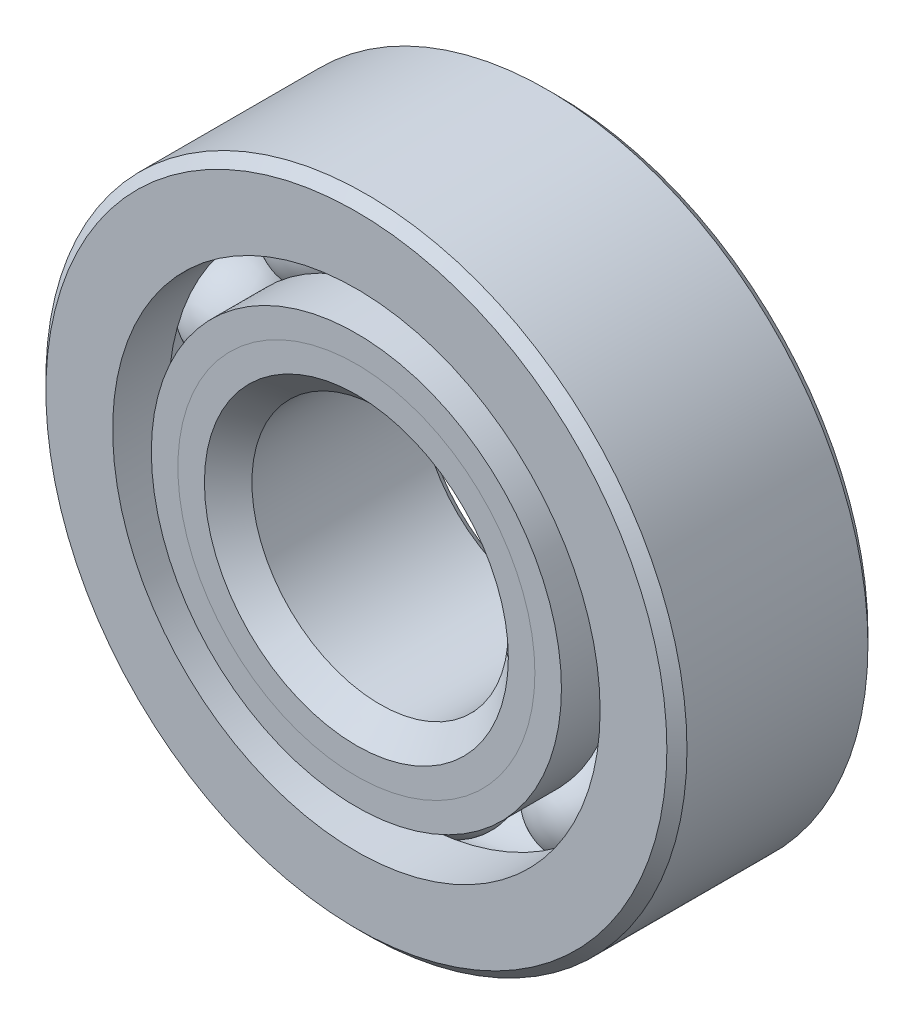
ISO-10303-21;
HEADER;
FILE_DESCRIPTION(('STEP AP214'),'2;1');
FILE_NAME('part.step','',(''),(''),'','','');
FILE_SCHEMA(('AUTOMOTIVE_DESIGN { 1 0 10303 214 1 1 1 1 }'));
ENDSEC;
DATA;
#1=APPLICATION_CONTEXT('core data for automotive mechanical design processes');
#2=APPLICATION_PROTOCOL_DEFINITION('international standard','automotive_design',2000,#1);
#3=PRODUCT_CONTEXT('',#1,'mechanical');
#4=PRODUCT('Part','Part','',(#3));
#5=PRODUCT_RELATED_PRODUCT_CATEGORY('part','',(#4));
#6=PRODUCT_DEFINITION_FORMATION('','',#4);
#7=PRODUCT_DEFINITION_CONTEXT('part definition',#1,'design');
#8=PRODUCT_DEFINITION('design','',#6,#7);
#9=PRODUCT_DEFINITION_SHAPE('','',#8);
#10=(LENGTH_UNIT() NAMED_UNIT(*) SI_UNIT(.MILLI.,.METRE.));
#11=(NAMED_UNIT(*) PLANE_ANGLE_UNIT() SI_UNIT($,.RADIAN.));
#12=(NAMED_UNIT(*) SI_UNIT($,.STERADIAN.) SOLID_ANGLE_UNIT());
#13=UNCERTAINTY_MEASURE_WITH_UNIT(LENGTH_MEASURE(1.E-05),#10,'distance_accuracy_value','');
#14=(GEOMETRIC_REPRESENTATION_CONTEXT(3) GLOBAL_UNCERTAINTY_ASSIGNED_CONTEXT((#13)) GLOBAL_UNIT_ASSIGNED_CONTEXT((#10,
#11,#12)) REPRESENTATION_CONTEXT('',''));
#15=CARTESIAN_POINT('',(0.,0.,0.));
#16=DIRECTION('',(0.,0.,1.));
#17=DIRECTION('',(1.,0.,0.));
#18=AXIS2_PLACEMENT_3D('',#15,#16,#17);
#19=CARTESIAN_POINT('',(-3.26588180805,4.49510067499584,0.));
#20=DIRECTION('',(0.,0.,1.));
#21=DIRECTION('',(-0.587785252292462,0.809016994374955,0.));
#22=AXIS2_PLACEMENT_3D('',#19,#20,#21);
#23=SPHERICAL_SURFACE('',#22,1.20554465033679);
#24=CARTESIAN_POINT('',(-3.26588180805,4.49510067499584,1.20554465033679));
#25=VERTEX_POINT('',#24);
#26=VERTEX_LOOP('',#25);
#27=FACE_BOUND('',#26,.T.);
#28=ADVANCED_FACE('F37',(#27),#23,.T.);
#29=CLOSED_SHELL('',(#28));
#30=MANIFOLD_SOLID_BREP('B2',#29);
#31=CARTESIAN_POINT('',(-5.28430776866493,1.71697567499586,0.));
#32=DIRECTION('',(0.,0.,1.));
#33=DIRECTION('',(-0.95105651629515,0.309016994374958,0.));
#34=AXIS2_PLACEMENT_3D('',#31,#32,#33);
#35=SPHERICAL_SURFACE('',#34,1.20554465033679);
#36=CARTESIAN_POINT('',(-5.28430776866493,1.71697567499586,1.20554465033679));
#37=VERTEX_POINT('',#36);
#38=VERTEX_LOOP('',#37);
#39=FACE_BOUND('',#38,.T.);
#40=ADVANCED_FACE('F68',(#39),#35,.T.);
#41=CLOSED_SHELL('',(#40));
#42=MANIFOLD_SOLID_BREP('B6',#41);
#43=CARTESIAN_POINT('',(-5.28430776866496,-1.71697567499575,0.));
#44=DIRECTION('',(0.,0.,1.));
#45=DIRECTION('',(-0.951056516295157,-0.309016994374938,0.));
#46=AXIS2_PLACEMENT_3D('',#43,#44,#45);
#47=SPHERICAL_SURFACE('',#46,1.20554465033679);
#48=CARTESIAN_POINT('',(-5.28430776866496,-1.71697567499575,1.20554465033679));
#49=VERTEX_POINT('',#48);
#50=VERTEX_LOOP('',#49);
#51=FACE_BOUND('',#50,.T.);
#52=ADVANCED_FACE('F97',(#51),#47,.T.);
#53=CLOSED_SHELL('',(#52));
#54=MANIFOLD_SOLID_BREP('B33',#53);
#55=CARTESIAN_POINT('',(-3.26588180805009,-4.49510067499577,0.));
#56=DIRECTION('',(0.,0.,1.));
#57=DIRECTION('',(-0.58778525229248,-0.809016994374942,0.));
#58=AXIS2_PLACEMENT_3D('',#55,#56,#57);
#59=SPHERICAL_SURFACE('',#58,1.20554465033679);
#60=CARTESIAN_POINT('',(-3.26588180805009,-4.49510067499577,1.20554465033679));
#61=VERTEX_POINT('',#60);
#62=VERTEX_LOOP('',#61);
#63=FACE_BOUND('',#62,.T.);
#64=ADVANCED_FACE('F128',(#63),#59,.T.);
#65=CLOSED_SHELL('',(#64));
#66=MANIFOLD_SOLID_BREP('B64',#65);
#67=CARTESIAN_POINT('',(0.,-5.55625,0.));
#68=DIRECTION('',(0.,0.,1.));
#69=DIRECTION('',(0.,-1.,0.));
#70=AXIS2_PLACEMENT_3D('',#67,#68,#69);
#71=SPHERICAL_SURFACE('',#70,1.20554465033679);
#72=CARTESIAN_POINT('',(0.,-5.55625,1.20554465033679));
#73=VERTEX_POINT('',#72);
#74=VERTEX_LOOP('',#73);
#75=FACE_BOUND('',#74,.T.);
#76=ADVANCED_FACE('F159',(#75),#71,.T.);
#77=CLOSED_SHELL('',(#76));
#78=MANIFOLD_SOLID_BREP('B93',#77);
#79=CARTESIAN_POINT('',(3.26588180805003,-4.49510067499582,0.));
#80=DIRECTION('',(0.,0.,1.));
#81=DIRECTION('',(0.587785252292469,-0.809016994374951,0.));
#82=AXIS2_PLACEMENT_3D('',#79,#80,#81);
#83=SPHERICAL_SURFACE('',#82,1.20554465033679);
#84=CARTESIAN_POINT('',(3.26588180805003,-4.49510067499582,1.20554465033679));
#85=VERTEX_POINT('',#84);
#86=VERTEX_LOOP('',#85);
#87=FACE_BOUND('',#86,.T.);
#88=ADVANCED_FACE('F190',(#87),#83,.T.);
#89=CLOSED_SHELL('',(#88));
#90=MANIFOLD_SOLID_BREP('B124',#89);
#91=CARTESIAN_POINT('',(5.28430776866494,-1.71697567499582,0.));
#92=DIRECTION('',(0.,0.,1.));
#93=DIRECTION('',(0.951056516295152,-0.309016994374952,0.));
#94=AXIS2_PLACEMENT_3D('',#91,#92,#93);
#95=SPHERICAL_SURFACE('',#94,1.20554465033679);
#96=CARTESIAN_POINT('',(5.28430776866494,-1.71697567499582,1.20554465033679));
#97=VERTEX_POINT('',#96);
#98=VERTEX_LOOP('',#97);
#99=FACE_BOUND('',#98,.T.);
#100=ADVANCED_FACE('F221',(#99),#95,.T.);
#101=CLOSED_SHELL('',(#100));
#102=MANIFOLD_SOLID_BREP('B155',#101);
#103=CARTESIAN_POINT('',(5.28430776866495,1.71697567499579,0.));
#104=DIRECTION('',(0.,0.,1.));
#105=DIRECTION('',(0.951056516295155,0.309016994374945,0.));
#106=AXIS2_PLACEMENT_3D('',#103,#104,#105);
#107=SPHERICAL_SURFACE('',#106,1.20554465033679);
#108=CARTESIAN_POINT('',(5.28430776866495,1.71697567499579,1.20554465033679));
#109=VERTEX_POINT('',#108);
#110=VERTEX_LOOP('',#109);
#111=FACE_BOUND('',#110,.T.);
#112=ADVANCED_FACE('F252',(#111),#107,.T.);
#113=CLOSED_SHELL('',(#112));
#114=MANIFOLD_SOLID_BREP('B186',#113);
#115=CARTESIAN_POINT('',(3.26588180805006,4.4951006749958,0.));
#116=DIRECTION('',(0.,0.,1.));
#117=DIRECTION('',(0.587785252292474,0.809016994374947,0.));
#118=AXIS2_PLACEMENT_3D('',#115,#116,#117);
#119=SPHERICAL_SURFACE('',#118,1.20554465033679);
#120=CARTESIAN_POINT('',(3.26588180805006,4.4951006749958,1.20554465033679));
#121=VERTEX_POINT('',#120);
#122=VERTEX_LOOP('',#121);
#123=FACE_BOUND('',#122,.T.);
#124=ADVANCED_FACE('F281',(#123),#119,.T.);
#125=CLOSED_SHELL('',(#124));
#126=MANIFOLD_SOLID_BREP('B217',#125);
#127=CARTESIAN_POINT('',(0.,5.55625,0.));
#128=DIRECTION('',(0.,0.,1.));
#129=DIRECTION('',(0.,1.,0.));
#130=AXIS2_PLACEMENT_3D('',#127,#128,#129);
#131=SPHERICAL_SURFACE('',#130,1.20554465033679);
#132=CARTESIAN_POINT('',(0.,5.55625,1.20554465033679));
#133=VERTEX_POINT('',#132);
#134=VERTEX_LOOP('',#133);
#135=FACE_BOUND('',#134,.T.);
#136=ADVANCED_FACE('F314',(#135),#131,.T.);
#137=CLOSED_SHELL('',(#136));
#138=MANIFOLD_SOLID_BREP('B248',#137);
#139=CARTESIAN_POINT('',(0.,4.42006562313009,2.4892));
#140=DIRECTION('',(0.,0.,-1.));
#141=DIRECTION('',(-1.,0.,0.));
#142=AXIS2_PLACEMENT_3D('',#139,#140,#141);
#143=PLANE('',#142);
#144=CARTESIAN_POINT('',(0.,0.,2.4892));
#145=DIRECTION('',(0.,0.,1.));
#146=DIRECTION('',(1.,0.,0.));
#147=AXIS2_PLACEMENT_3D('',#144,#145,#146);
#148=CIRCLE('',#147,3.76285267483161);
#149=CARTESIAN_POINT('',(3.76285267483161,0.,2.4892));
#150=VERTEX_POINT('',#149);
#151=EDGE_CURVE('E368',#150,#150,#148,.T.);
#152=ORIENTED_EDGE('',*,*,#151,.F.);
#153=EDGE_LOOP('',(#152));
#154=FACE_BOUND('',#153,.T.);
#155=CARTESIAN_POINT('',(0.,0.,2.4892));
#156=DIRECTION('',(0.,0.,1.));
#157=DIRECTION('',(1.,0.,0.));
#158=AXIS2_PLACEMENT_3D('',#155,#156,#157);
#159=CIRCLE('',#158,4.42006562313009);
#160=CARTESIAN_POINT('',(4.42006562313009,0.,2.4892));
#161=VERTEX_POINT('',#160);
#162=EDGE_CURVE('E313',#161,#161,#159,.T.);
#163=ORIENTED_EDGE('',*,*,#162,.T.);
#164=EDGE_LOOP('',(#163));
#165=FACE_BOUND('',#164,.T.);
#166=ADVANCED_FACE('F334',(#154,#165),#143,.F.);
#167=CARTESIAN_POINT('',(0.,0.,1.83198705170152));
#168=DIRECTION('',(0.,0.,1.));
#169=DIRECTION('',(1.,0.,0.));
#170=AXIS2_PLACEMENT_3D('',#167,#168,#169);
#171=CONICAL_SURFACE('',#170,3.7628526748316,0.78539816339745);
#172=ORIENTED_EDGE('',*,*,#162,.F.);
#173=EDGE_LOOP('',(#172));
#174=FACE_BOUND('',#173,.T.);
#175=CARTESIAN_POINT('',(0.,0.,1.83198705170152));
#176=DIRECTION('',(0.,0.,1.));
#177=DIRECTION('',(1.,0.,0.));
#178=AXIS2_PLACEMENT_3D('',#175,#176,#177);
#179=CIRCLE('',#178,3.7628526748316);
#180=CARTESIAN_POINT('',(3.7628526748316,0.,1.83198705170152));
#181=VERTEX_POINT('',#180);
#182=EDGE_CURVE('E340',#181,#181,#179,.T.);
#183=ORIENTED_EDGE('',*,*,#182,.T.);
#184=EDGE_LOOP('',(#183));
#185=FACE_BOUND('',#184,.T.);
#186=ADVANCED_FACE('F375',(#174,#185),#171,.T.);
#187=CARTESIAN_POINT('',(0.,0.,2.4892));
#188=DIRECTION('',(0.,0.,1.));
#189=DIRECTION('',(1.,0.,0.));
#190=AXIS2_PLACEMENT_3D('',#187,#188,#189);
#191=CYLINDRICAL_SURFACE('',#190,3.7628526748316);
#192=ORIENTED_EDGE('',*,*,#182,.F.);
#193=EDGE_LOOP('',(#192));
#194=FACE_BOUND('',#193,.T.);
#195=CARTESIAN_POINT('',(0.,0.,0.));
#196=DIRECTION('',(0.,0.,1.));
#197=DIRECTION('',(1.,0.,0.));
#198=AXIS2_PLACEMENT_3D('',#195,#196,#197);
#199=CIRCLE('',#198,3.7628526748316);
#200=CARTESIAN_POINT('',(3.7628526748316,0.,0.));
#201=VERTEX_POINT('',#200);
#202=EDGE_CURVE('E344',#201,#201,#199,.T.);
#203=ORIENTED_EDGE('',*,*,#202,.T.);
#204=EDGE_LOOP('',(#203));
#205=FACE_BOUND('',#204,.T.);
#206=ADVANCED_FACE('F379',(#194,#205),#191,.T.);
#207=CARTESIAN_POINT('',(0.,3.7628526748316,0.));
#208=DIRECTION('',(0.,0.,-1.));
#209=DIRECTION('',(-1.,0.,0.));
#210=AXIS2_PLACEMENT_3D('',#207,#208,#209);
#211=PLANE('',#210);
#212=ORIENTED_EDGE('',*,*,#202,.F.);
#213=EDGE_LOOP('',(#212));
#214=FACE_BOUND('',#213,.T.);
#215=CARTESIAN_POINT('',(0.,0.,0.));
#216=DIRECTION('',(0.,0.,1.));
#217=DIRECTION('',(1.,0.,0.));
#218=AXIS2_PLACEMENT_3D('',#215,#216,#217);
#219=CIRCLE('',#218,4.35070534966321);
#220=CARTESIAN_POINT('',(4.35070534966321,0.,0.));
#221=VERTEX_POINT('',#220);
#222=EDGE_CURVE('E348',#221,#221,#219,.T.);
#223=ORIENTED_EDGE('',*,*,#222,.T.);
#224=EDGE_LOOP('',(#223));
#225=FACE_BOUND('',#224,.T.);
#226=ADVANCED_FACE('F384',(#214,#225),#211,.F.);
#227=CARTESIAN_POINT('',(0.,0.,0.));
#228=DIRECTION('',(0.,0.,1.));
#229=DIRECTION('',(1.,0.,0.));
#230=AXIS2_PLACEMENT_3D('',#227,#228,#229);
#231=TOROIDAL_SURFACE('',#230,5.55625,1.20554465033679);
#232=ORIENTED_EDGE('',*,*,#222,.F.);
#233=EDGE_LOOP('',(#232));
#234=FACE_BOUND('',#233,.T.);
#235=CARTESIAN_POINT('',(0.,0.,-1.10631111111111));
#236=DIRECTION('',(0.,0.,1.));
#237=DIRECTION('',(1.,0.,0.));
#238=AXIS2_PLACEMENT_3D('',#235,#236,#237);
#239=CIRCLE('',#238,5.07727857142857);
#240=CARTESIAN_POINT('',(5.07727857142857,0.,-1.10631111111111));
#241=VERTEX_POINT('',#240);
#242=EDGE_CURVE('E353',#241,#241,#239,.T.);
#243=ORIENTED_EDGE('',*,*,#242,.T.);
#244=EDGE_LOOP('',(#243));
#245=FACE_BOUND('',#244,.T.);
#246=ADVANCED_FACE('F390',(#234,#245),#231,.F.);
#247=CARTESIAN_POINT('',(0.,0.,2.4892));
#248=DIRECTION('',(0.,0.,1.));
#249=DIRECTION('',(1.,0.,0.));
#250=AXIS2_PLACEMENT_3D('',#247,#248,#249);
#251=CYLINDRICAL_SURFACE('',#250,5.07727857142857);
#252=ORIENTED_EDGE('',*,*,#242,.F.);
#253=EDGE_LOOP('',(#252));
#254=FACE_BOUND('',#253,.T.);
#255=CARTESIAN_POINT('',(0.,0.,-2.4892));
#256=DIRECTION('',(0.,0.,1.));
#257=DIRECTION('',(1.,0.,0.));
#258=AXIS2_PLACEMENT_3D('',#255,#256,#257);
#259=CIRCLE('',#258,5.07727857142857);
#260=CARTESIAN_POINT('',(5.07727857142857,0.,-2.4892));
#261=VERTEX_POINT('',#260);
#262=EDGE_CURVE('E356',#261,#261,#259,.T.);
#263=ORIENTED_EDGE('',*,*,#262,.T.);
#264=EDGE_LOOP('',(#263));
#265=FACE_BOUND('',#264,.T.);
#266=ADVANCED_FACE('F394',(#254,#265),#251,.T.);
#267=CARTESIAN_POINT('',(0.,3.42392,-2.4892));
#268=DIRECTION('',(0.,0.,1.));
#269=DIRECTION('',(1.,0.,0.));
#270=AXIS2_PLACEMENT_3D('',#267,#268,#269);
#271=PLANE('',#270);
#272=ORIENTED_EDGE('',*,*,#262,.F.);
#273=EDGE_LOOP('',(#272));
#274=FACE_BOUND('',#273,.T.);
#275=CARTESIAN_POINT('',(0.,0.,-2.4892));
#276=DIRECTION('',(0.,0.,1.));
#277=DIRECTION('',(1.,0.,0.));
#278=AXIS2_PLACEMENT_3D('',#275,#276,#277);
#279=CIRCLE('',#278,3.42392);
#280=CARTESIAN_POINT('',(3.42392,0.,-2.4892));
#281=VERTEX_POINT('',#280);
#282=EDGE_CURVE('E359',#281,#281,#279,.T.);
#283=ORIENTED_EDGE('',*,*,#282,.T.);
#284=EDGE_LOOP('',(#283));
#285=FACE_BOUND('',#284,.T.);
#286=ADVANCED_FACE('F398',(#274,#285),#271,.F.);
#287=CARTESIAN_POINT('',(0.,0.,-2.24028));
#288=DIRECTION('',(0.,0.,-1.));
#289=DIRECTION('',(-1.,0.,0.));
#290=AXIS2_PLACEMENT_3D('',#287,#288,#289);
#291=CONICAL_SURFACE('',#290,3.175,0.785398163397448);
#292=ORIENTED_EDGE('',*,*,#282,.F.);
#293=EDGE_LOOP('',(#292));
#294=FACE_BOUND('',#293,.T.);
#295=CARTESIAN_POINT('',(0.,0.,-2.24028));
#296=DIRECTION('',(0.,0.,1.));
#297=DIRECTION('',(1.,0.,0.));
#298=AXIS2_PLACEMENT_3D('',#295,#296,#297);
#299=CIRCLE('',#298,3.175);
#300=CARTESIAN_POINT('',(3.175,0.,-2.24028));
#301=VERTEX_POINT('',#300);
#302=EDGE_CURVE('E362',#301,#301,#299,.T.);
#303=ORIENTED_EDGE('',*,*,#302,.T.);
#304=EDGE_LOOP('',(#303));
#305=FACE_BOUND('',#304,.T.);
#306=ADVANCED_FACE('F402',(#294,#305),#291,.F.);
#307=CARTESIAN_POINT('',(0.,0.,2.4892));
#308=DIRECTION('',(0.,0.,1.));
#309=DIRECTION('',(1.,0.,0.));
#310=AXIS2_PLACEMENT_3D('',#307,#308,#309);
#311=CYLINDRICAL_SURFACE('',#310,3.175);
#312=ORIENTED_EDGE('',*,*,#302,.F.);
#313=EDGE_LOOP('',(#312));
#314=FACE_BOUND('',#313,.T.);
#315=CARTESIAN_POINT('',(0.,0.,1.9013473251684));
#316=DIRECTION('',(0.,0.,1.));
#317=DIRECTION('',(1.,0.,0.));
#318=AXIS2_PLACEMENT_3D('',#315,#316,#317);
#319=CIRCLE('',#318,3.175);
#320=CARTESIAN_POINT('',(3.175,0.,1.9013473251684));
#321=VERTEX_POINT('',#320);
#322=EDGE_CURVE('E365',#321,#321,#319,.T.);
#323=ORIENTED_EDGE('',*,*,#322,.T.);
#324=EDGE_LOOP('',(#323));
#325=FACE_BOUND('',#324,.T.);
#326=ADVANCED_FACE('F406',(#314,#325),#311,.F.);
#327=CARTESIAN_POINT('',(0.,0.,2.4892));
#328=DIRECTION('',(0.,0.,1.));
#329=DIRECTION('',(1.,0.,0.));
#330=AXIS2_PLACEMENT_3D('',#327,#328,#329);
#331=CONICAL_SURFACE('',#330,3.76285267483161,0.785398163397451);
#332=ORIENTED_EDGE('',*,*,#322,.F.);
#333=EDGE_LOOP('',(#332));
#334=FACE_BOUND('',#333,.T.);
#335=ORIENTED_EDGE('',*,*,#151,.T.);
#336=EDGE_LOOP('',(#335));
#337=FACE_BOUND('',#336,.T.);
#338=ADVANCED_FACE('F372',(#334,#337),#331,.F.);
#339=CLOSED_SHELL('',(#166,#186,#206,#226,#246,#266,#286,#306,#326,#338));
#340=MANIFOLD_SOLID_BREP('B277',#339);
#341=CARTESIAN_POINT('',(0.,5.07727857142857,2.4892));
#342=DIRECTION('',(0.,0.,-1.));
#343=DIRECTION('',(-1.,0.,0.));
#344=AXIS2_PLACEMENT_3D('',#341,#342,#343);
#345=PLANE('',#344);
#346=CARTESIAN_POINT('',(0.,0.,2.4892));
#347=DIRECTION('',(0.,0.,1.));
#348=DIRECTION('',(1.,0.,0.));
#349=AXIS2_PLACEMENT_3D('',#346,#347,#348);
#350=CIRCLE('',#349,4.42006562313009);
#351=CARTESIAN_POINT('',(4.42006562313009,0.,2.4892));
#352=VERTEX_POINT('',#351);
#353=EDGE_CURVE('E333',#352,#352,#350,.T.);
#354=ORIENTED_EDGE('',*,*,#353,.F.);
#355=EDGE_LOOP('',(#354));
#356=FACE_BOUND('',#355,.T.);
#357=CARTESIAN_POINT('',(0.,0.,2.4892));
#358=DIRECTION('',(0.,0.,1.));
#359=DIRECTION('',(1.,0.,0.));
#360=AXIS2_PLACEMENT_3D('',#357,#358,#359);
#361=CIRCLE('',#360,5.07727857142857);
#362=CARTESIAN_POINT('',(5.07727857142857,0.,2.4892));
#363=VERTEX_POINT('',#362);
#364=EDGE_CURVE('E514',#363,#363,#361,.T.);
#365=ORIENTED_EDGE('',*,*,#364,.T.);
#366=EDGE_LOOP('',(#365));
#367=FACE_BOUND('',#366,.T.);
#368=ADVANCED_FACE('F492',(#356,#367),#345,.F.);
#369=CARTESIAN_POINT('',(0.,0.,2.4892));
#370=DIRECTION('',(0.,0.,1.));
#371=DIRECTION('',(1.,0.,0.));
#372=AXIS2_PLACEMENT_3D('',#369,#370,#371);
#373=CONICAL_SURFACE('',#372,4.42006562313009,0.78539816339745);
#374=CARTESIAN_POINT('',(0.,0.,1.83198705170152));
#375=DIRECTION('',(0.,0.,1.));
#376=DIRECTION('',(1.,0.,0.));
#377=AXIS2_PLACEMENT_3D('',#374,#375,#376);
#378=CIRCLE('',#377,3.7628526748316);
#379=CARTESIAN_POINT('',(3.7628526748316,0.,1.83198705170152));
#380=VERTEX_POINT('',#379);
#381=EDGE_CURVE('E498',#380,#380,#378,.T.);
#382=ORIENTED_EDGE('',*,*,#381,.F.);
#383=EDGE_LOOP('',(#382));
#384=FACE_BOUND('',#383,.T.);
#385=ORIENTED_EDGE('',*,*,#353,.T.);
#386=EDGE_LOOP('',(#385));
#387=FACE_BOUND('',#386,.T.);
#388=ADVANCED_FACE('F539',(#384,#387),#373,.F.);
#389=CARTESIAN_POINT('',(0.,0.,2.4892));
#390=DIRECTION('',(0.,0.,1.));
#391=DIRECTION('',(1.,0.,0.));
#392=AXIS2_PLACEMENT_3D('',#389,#390,#391);
#393=CYLINDRICAL_SURFACE('',#392,3.7628526748316);
#394=CARTESIAN_POINT('',(0.,0.,0.));
#395=DIRECTION('',(0.,0.,1.));
#396=DIRECTION('',(1.,0.,0.));
#397=AXIS2_PLACEMENT_3D('',#394,#395,#396);
#398=CIRCLE('',#397,3.7628526748316);
#399=CARTESIAN_POINT('',(3.7628526748316,0.,0.));
#400=VERTEX_POINT('',#399);
#401=EDGE_CURVE('E502',#400,#400,#398,.T.);
#402=ORIENTED_EDGE('',*,*,#401,.F.);
#403=EDGE_LOOP('',(#402));
#404=FACE_BOUND('',#403,.T.);
#405=ORIENTED_EDGE('',*,*,#381,.T.);
#406=EDGE_LOOP('',(#405));
#407=FACE_BOUND('',#406,.T.);
#408=ADVANCED_FACE('F534',(#404,#407),#393,.F.);
#409=CARTESIAN_POINT('',(0.,3.7628526748316,0.));
#410=DIRECTION('',(0.,0.,1.));
#411=DIRECTION('',(1.,0.,0.));
#412=AXIS2_PLACEMENT_3D('',#409,#410,#411);
#413=PLANE('',#412);
#414=CARTESIAN_POINT('',(0.,0.,0.));
#415=DIRECTION('',(0.,0.,1.));
#416=DIRECTION('',(1.,0.,0.));
#417=AXIS2_PLACEMENT_3D('',#414,#415,#416);
#418=CIRCLE('',#417,4.35070534966321);
#419=CARTESIAN_POINT('',(4.35070534966321,0.,0.));
#420=VERTEX_POINT('',#419);
#421=EDGE_CURVE('E506',#420,#420,#418,.T.);
#422=ORIENTED_EDGE('',*,*,#421,.F.);
#423=EDGE_LOOP('',(#422));
#424=FACE_BOUND('',#423,.T.);
#425=ORIENTED_EDGE('',*,*,#401,.T.);
#426=EDGE_LOOP('',(#425));
#427=FACE_BOUND('',#426,.T.);
#428=ADVANCED_FACE('F528',(#424,#427),#413,.F.);
#429=CARTESIAN_POINT('',(0.,0.,0.));
#430=DIRECTION('',(0.,0.,1.));
#431=DIRECTION('',(1.,0.,0.));
#432=AXIS2_PLACEMENT_3D('',#429,#430,#431);
#433=TOROIDAL_SURFACE('',#432,5.55625,1.20554465033679);
#434=CARTESIAN_POINT('',(0.,0.,1.10631111111111));
#435=DIRECTION('',(0.,0.,1.));
#436=DIRECTION('',(1.,0.,0.));
#437=AXIS2_PLACEMENT_3D('',#434,#435,#436);
#438=CIRCLE('',#437,5.07727857142857);
#439=CARTESIAN_POINT('',(5.07727857142857,0.,1.10631111111111));
#440=VERTEX_POINT('',#439);
#441=EDGE_CURVE('E511',#440,#440,#438,.T.);
#442=ORIENTED_EDGE('',*,*,#441,.F.);
#443=EDGE_LOOP('',(#442));
#444=FACE_BOUND('',#443,.T.);
#445=ORIENTED_EDGE('',*,*,#421,.T.);
#446=EDGE_LOOP('',(#445));
#447=FACE_BOUND('',#446,.T.);
#448=ADVANCED_FACE('F522',(#444,#447),#433,.F.);
#449=CARTESIAN_POINT('',(0.,0.,2.4892));
#450=DIRECTION('',(0.,0.,1.));
#451=DIRECTION('',(1.,0.,0.));
#452=AXIS2_PLACEMENT_3D('',#449,#450,#451);
#453=CYLINDRICAL_SURFACE('',#452,5.07727857142857);
#454=ORIENTED_EDGE('',*,*,#364,.F.);
#455=EDGE_LOOP('',(#454));
#456=FACE_BOUND('',#455,.T.);
#457=ORIENTED_EDGE('',*,*,#441,.T.);
#458=EDGE_LOOP('',(#457));
#459=FACE_BOUND('',#458,.T.);
#460=ADVANCED_FACE('F519',(#456,#459),#453,.T.);
#461=CLOSED_SHELL('',(#368,#388,#408,#428,#448,#460));
#462=MANIFOLD_SOLID_BREP('B308',#461);
#463=CARTESIAN_POINT('',(0.,0.,2.24028));
#464=DIRECTION('',(0.,0.,-1.));
#465=DIRECTION('',(-1.,0.,0.));
#466=AXIS2_PLACEMENT_3D('',#463,#464,#465);
#467=CONICAL_SURFACE('',#466,7.9375,0.785398163397449);
#468=CARTESIAN_POINT('',(0.,0.,2.4892));
#469=DIRECTION('',(0.,0.,1.));
#470=DIRECTION('',(1.,0.,0.));
#471=AXIS2_PLACEMENT_3D('',#468,#469,#470);
#472=CIRCLE('',#471,7.68858);
#473=CARTESIAN_POINT('',(7.68858,0.,2.4892));
#474=VERTEX_POINT('',#473);
#475=EDGE_CURVE('E611',#474,#474,#472,.T.);
#476=ORIENTED_EDGE('',*,*,#475,.F.);
#477=EDGE_LOOP('',(#476));
#478=FACE_BOUND('',#477,.T.);
#479=CARTESIAN_POINT('',(0.,0.,2.24028));
#480=DIRECTION('',(0.,0.,1.));
#481=DIRECTION('',(1.,0.,0.));
#482=AXIS2_PLACEMENT_3D('',#479,#480,#481);
#483=CIRCLE('',#482,7.9375);
#484=CARTESIAN_POINT('',(7.9375,0.,2.24028));
#485=VERTEX_POINT('',#484);
#486=EDGE_CURVE('E491',#485,#485,#483,.T.);
#487=ORIENTED_EDGE('',*,*,#486,.T.);
#488=EDGE_LOOP('',(#487));
#489=FACE_BOUND('',#488,.T.);
#490=ADVANCED_FACE('F583',(#478,#489),#467,.T.);
#491=CARTESIAN_POINT('',(0.,0.,2.4892));
#492=DIRECTION('',(0.,0.,1.));
#493=DIRECTION('',(1.,0.,0.));
#494=AXIS2_PLACEMENT_3D('',#491,#492,#493);
#495=CYLINDRICAL_SURFACE('',#494,7.9375);
#496=ORIENTED_EDGE('',*,*,#486,.F.);
#497=EDGE_LOOP('',(#496));
#498=FACE_BOUND('',#497,.T.);
#499=CARTESIAN_POINT('',(0.,0.,-2.24028));
#500=DIRECTION('',(0.,0.,1.));
#501=DIRECTION('',(1.,0.,0.));
#502=AXIS2_PLACEMENT_3D('',#499,#500,#501);
#503=CIRCLE('',#502,7.9375);
#504=CARTESIAN_POINT('',(7.9375,0.,-2.24028));
#505=VERTEX_POINT('',#504);
#506=EDGE_CURVE('E589',#505,#505,#503,.T.);
#507=ORIENTED_EDGE('',*,*,#506,.T.);
#508=EDGE_LOOP('',(#507));
#509=FACE_BOUND('',#508,.T.);
#510=ADVANCED_FACE('F618',(#498,#509),#495,.T.);
#511=CARTESIAN_POINT('',(0.,0.,-2.4892));
#512=DIRECTION('',(0.,0.,1.));
#513=DIRECTION('',(1.,0.,0.));
#514=AXIS2_PLACEMENT_3D('',#511,#512,#513);
#515=CONICAL_SURFACE('',#514,7.68858,0.785398163397447);
#516=ORIENTED_EDGE('',*,*,#506,.F.);
#517=EDGE_LOOP('',(#516));
#518=FACE_BOUND('',#517,.T.);
#519=CARTESIAN_POINT('',(0.,0.,-2.4892));
#520=DIRECTION('',(0.,0.,1.));
#521=DIRECTION('',(1.,0.,0.));
#522=AXIS2_PLACEMENT_3D('',#519,#520,#521);
#523=CIRCLE('',#522,7.68858);
#524=CARTESIAN_POINT('',(7.68858,0.,-2.4892));
#525=VERTEX_POINT('',#524);
#526=EDGE_CURVE('E593',#525,#525,#523,.T.);
#527=ORIENTED_EDGE('',*,*,#526,.T.);
#528=EDGE_LOOP('',(#527));
#529=FACE_BOUND('',#528,.T.);
#530=ADVANCED_FACE('F622',(#518,#529),#515,.T.);
#531=CARTESIAN_POINT('',(0.,7.68858,-2.4892));
#532=DIRECTION('',(0.,0.,1.));
#533=DIRECTION('',(1.,0.,0.));
#534=AXIS2_PLACEMENT_3D('',#531,#532,#533);
#535=PLANE('',#534);
#536=ORIENTED_EDGE('',*,*,#526,.F.);
#537=EDGE_LOOP('',(#536));
#538=FACE_BOUND('',#537,.T.);
#539=CARTESIAN_POINT('',(0.,0.,-2.4892));
#540=DIRECTION('',(0.,0.,1.));
#541=DIRECTION('',(1.,0.,0.));
#542=AXIS2_PLACEMENT_3D('',#539,#540,#541);
#543=CIRCLE('',#542,6.03522142857143);
#544=CARTESIAN_POINT('',(6.03522142857143,0.,-2.4892));
#545=VERTEX_POINT('',#544);
#546=EDGE_CURVE('E597',#545,#545,#543,.T.);
#547=ORIENTED_EDGE('',*,*,#546,.T.);
#548=EDGE_LOOP('',(#547));
#549=FACE_BOUND('',#548,.T.);
#550=ADVANCED_FACE('F627',(#538,#549),#535,.F.);
#551=CARTESIAN_POINT('',(0.,0.,2.4892));
#552=DIRECTION('',(0.,0.,1.));
#553=DIRECTION('',(1.,0.,0.));
#554=AXIS2_PLACEMENT_3D('',#551,#552,#553);
#555=CYLINDRICAL_SURFACE('',#554,6.03522142857143);
#556=ORIENTED_EDGE('',*,*,#546,.F.);
#557=EDGE_LOOP('',(#556));
#558=FACE_BOUND('',#557,.T.);
#559=CARTESIAN_POINT('',(0.,0.,-1.10631111111111));
#560=DIRECTION('',(0.,0.,1.));
#561=DIRECTION('',(1.,0.,0.));
#562=AXIS2_PLACEMENT_3D('',#559,#560,#561);
#563=CIRCLE('',#562,6.03522142857143);
#564=CARTESIAN_POINT('',(6.03522142857143,0.,-1.10631111111111));
#565=VERTEX_POINT('',#564);
#566=EDGE_CURVE('E602',#565,#565,#563,.T.);
#567=ORIENTED_EDGE('',*,*,#566,.T.);
#568=EDGE_LOOP('',(#567));
#569=FACE_BOUND('',#568,.T.);
#570=ADVANCED_FACE('F633',(#558,#569),#555,.F.);
#571=CARTESIAN_POINT('',(0.,0.,0.));
#572=DIRECTION('',(0.,0.,1.));
#573=DIRECTION('',(1.,0.,0.));
#574=AXIS2_PLACEMENT_3D('',#571,#572,#573);
#575=TOROIDAL_SURFACE('',#574,5.55625,1.20554465033679);
#576=ORIENTED_EDGE('',*,*,#566,.F.);
#577=EDGE_LOOP('',(#576));
#578=FACE_BOUND('',#577,.T.);
#579=CARTESIAN_POINT('',(0.,0.,1.10631111111111));
#580=DIRECTION('',(0.,0.,1.));
#581=DIRECTION('',(1.,0.,0.));
#582=AXIS2_PLACEMENT_3D('',#579,#580,#581);
#583=CIRCLE('',#582,6.03522142857143);
#584=CARTESIAN_POINT('',(6.03522142857143,0.,1.10631111111111));
#585=VERTEX_POINT('',#584);
#586=EDGE_CURVE('E605',#585,#585,#583,.T.);
#587=ORIENTED_EDGE('',*,*,#586,.T.);
#588=EDGE_LOOP('',(#587));
#589=FACE_BOUND('',#588,.T.);
#590=ADVANCED_FACE('F637',(#578,#589),#575,.F.);
#591=CARTESIAN_POINT('',(0.,0.,2.4892));
#592=DIRECTION('',(0.,0.,1.));
#593=DIRECTION('',(1.,0.,0.));
#594=AXIS2_PLACEMENT_3D('',#591,#592,#593);
#595=CYLINDRICAL_SURFACE('',#594,6.03522142857143);
#596=ORIENTED_EDGE('',*,*,#586,.F.);
#597=EDGE_LOOP('',(#596));
#598=FACE_BOUND('',#597,.T.);
#599=CARTESIAN_POINT('',(0.,0.,2.4892));
#600=DIRECTION('',(0.,0.,1.));
#601=DIRECTION('',(1.,0.,0.));
#602=AXIS2_PLACEMENT_3D('',#599,#600,#601);
#603=CIRCLE('',#602,6.03522142857143);
#604=CARTESIAN_POINT('',(6.03522142857143,0.,2.4892));
#605=VERTEX_POINT('',#604);
#606=EDGE_CURVE('E608',#605,#605,#603,.T.);
#607=ORIENTED_EDGE('',*,*,#606,.T.);
#608=EDGE_LOOP('',(#607));
#609=FACE_BOUND('',#608,.T.);
#610=ADVANCED_FACE('F641',(#598,#609),#595,.F.);
#611=CARTESIAN_POINT('',(0.,7.68858,2.4892));
#612=DIRECTION('',(0.,0.,-1.));
#613=DIRECTION('',(-1.,0.,0.));
#614=AXIS2_PLACEMENT_3D('',#611,#612,#613);
#615=PLANE('',#614);
#616=ORIENTED_EDGE('',*,*,#606,.F.);
#617=EDGE_LOOP('',(#616));
#618=FACE_BOUND('',#617,.T.);
#619=ORIENTED_EDGE('',*,*,#475,.T.);
#620=EDGE_LOOP('',(#619));
#621=FACE_BOUND('',#620,.T.);
#622=ADVANCED_FACE('F615',(#618,#621),#615,.F.);
#623=CLOSED_SHELL('',(#490,#510,#530,#550,#570,#590,#610,#622));
#624=MANIFOLD_SOLID_BREP('B328',#623);
#625=ADVANCED_BREP_SHAPE_REPRESENTATION('',(#18,#30,#42,#54,#66,#78,#90,#102,#114,#126,#138,
#340,#462,#624),#14);
#626=SHAPE_DEFINITION_REPRESENTATION(#9,#625);
ENDSEC;
END-ISO-10303-21;
